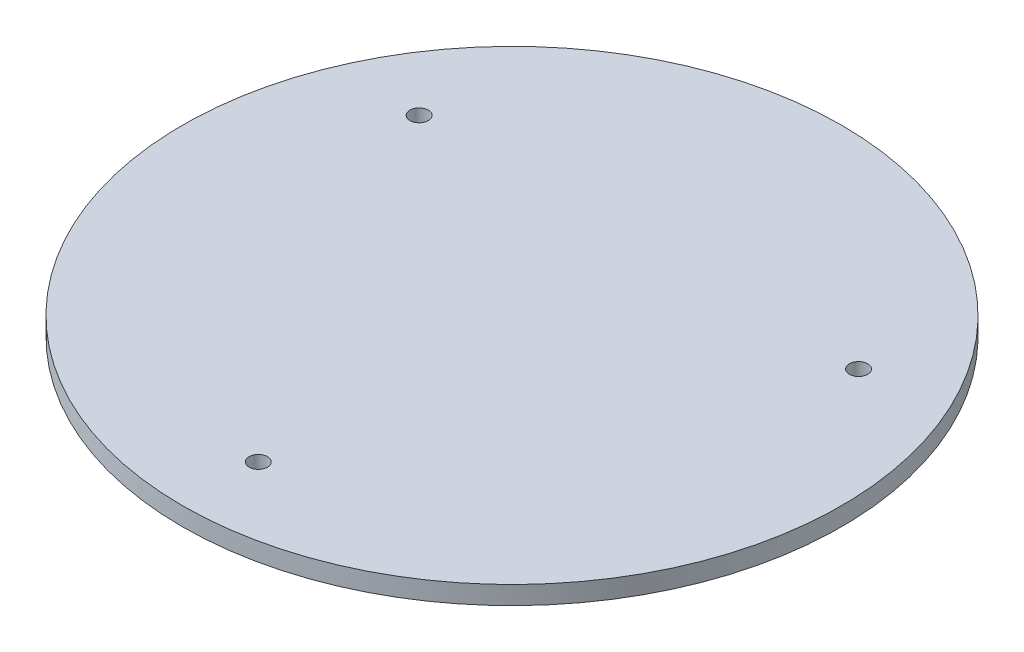
ISO-10303-21;
HEADER;
FILE_DESCRIPTION(('STEP AP214'),'2;1');
FILE_NAME('part.step','',(''),(''),'','','');
FILE_SCHEMA(('AUTOMOTIVE_DESIGN { 1 0 10303 214 1 1 1 1 }'));
ENDSEC;
DATA;
#1=APPLICATION_CONTEXT('core data for automotive mechanical design processes');
#2=APPLICATION_PROTOCOL_DEFINITION('international standard','automotive_design',2000,#1);
#3=PRODUCT_CONTEXT('',#1,'mechanical');
#4=PRODUCT('Part','Part','',(#3));
#5=PRODUCT_RELATED_PRODUCT_CATEGORY('part','',(#4));
#6=PRODUCT_DEFINITION_FORMATION('','',#4);
#7=PRODUCT_DEFINITION_CONTEXT('part definition',#1,'design');
#8=PRODUCT_DEFINITION('design','',#6,#7);
#9=PRODUCT_DEFINITION_SHAPE('','',#8);
#10=(LENGTH_UNIT() NAMED_UNIT(*) SI_UNIT(.MILLI.,.METRE.));
#11=(NAMED_UNIT(*) PLANE_ANGLE_UNIT() SI_UNIT($,.RADIAN.));
#12=(NAMED_UNIT(*) SI_UNIT($,.STERADIAN.) SOLID_ANGLE_UNIT());
#13=UNCERTAINTY_MEASURE_WITH_UNIT(LENGTH_MEASURE(1.E-05),#10,'distance_accuracy_value','');
#14=(GEOMETRIC_REPRESENTATION_CONTEXT(3) GLOBAL_UNCERTAINTY_ASSIGNED_CONTEXT((#13)) GLOBAL_UNIT_ASSIGNED_CONTEXT((#10,
#11,#12)) REPRESENTATION_CONTEXT('',''));
#15=CARTESIAN_POINT('',(0.,0.,0.));
#16=DIRECTION('',(0.,0.,1.));
#17=DIRECTION('',(1.,0.,0.));
#18=AXIS2_PLACEMENT_3D('',#15,#16,#17);
#19=CARTESIAN_POINT('',(0.,3.175,0.));
#20=DIRECTION('',(0.,-1.,0.));
#21=DIRECTION('',(0.,0.,-1.));
#22=AXIS2_PLACEMENT_3D('',#19,#20,#21);
#23=CYLINDRICAL_SURFACE('',#22,57.15);
#24=CARTESIAN_POINT('',(0.,3.175,0.));
#25=DIRECTION('',(0.,1.,0.));
#26=DIRECTION('',(0.,0.,1.));
#27=AXIS2_PLACEMENT_3D('',#24,#25,#26);
#28=CIRCLE('',#27,57.15);
#29=CARTESIAN_POINT('',(0.,3.175,57.15));
#30=VERTEX_POINT('',#29);
#31=EDGE_CURVE('E10',#30,#30,#28,.T.);
#32=ORIENTED_EDGE('',*,*,#31,.F.);
#33=EDGE_LOOP('',(#32));
#34=FACE_BOUND('',#33,.T.);
#35=CARTESIAN_POINT('',(0.,0.,0.));
#36=DIRECTION('',(0.,1.,0.));
#37=DIRECTION('',(0.,0.,1.));
#38=AXIS2_PLACEMENT_3D('',#35,#36,#37);
#39=CIRCLE('',#38,57.15);
#40=CARTESIAN_POINT('',(0.,0.,57.15));
#41=VERTEX_POINT('',#40);
#42=EDGE_CURVE('E38',#41,#41,#39,.T.);
#43=ORIENTED_EDGE('',*,*,#42,.T.);
#44=EDGE_LOOP('',(#43));
#45=FACE_BOUND('',#44,.T.);
#46=ADVANCED_FACE('F35',(#34,#45),#23,.T.);
#47=CARTESIAN_POINT('',(0.,3.175,0.));
#48=DIRECTION('',(0.,1.,0.));
#49=DIRECTION('',(0.,0.,1.));
#50=AXIS2_PLACEMENT_3D('',#47,#48,#49);
#51=PLANE('',#50);
#52=CARTESIAN_POINT('',(0.,3.175,43.9940905122495));
#53=DIRECTION('',(0.,1.,0.));
#54=DIRECTION('',(0.,0.,1.));
#55=AXIS2_PLACEMENT_3D('',#52,#53,#54);
#56=CIRCLE('',#55,1.5875);
#57=CARTESIAN_POINT('',(0.,3.175,45.5815905122495));
#58=VERTEX_POINT('',#57);
#59=EDGE_CURVE('E59',#58,#58,#56,.T.);
#60=ORIENTED_EDGE('',*,*,#59,.F.);
#61=EDGE_LOOP('',(#60));
#62=FACE_BOUND('',#61,.T.);
#63=CARTESIAN_POINT('',(-38.1,3.175,-21.9970452561247));
#64=DIRECTION('',(0.,1.,0.));
#65=DIRECTION('',(0.,0.,1.));
#66=AXIS2_PLACEMENT_3D('',#63,#64,#65);
#67=CIRCLE('',#66,1.5875);
#68=CARTESIAN_POINT('',(-38.1,3.175,-20.4095452561247));
#69=VERTEX_POINT('',#68);
#70=EDGE_CURVE('E53',#69,#69,#67,.T.);
#71=ORIENTED_EDGE('',*,*,#70,.F.);
#72=EDGE_LOOP('',(#71));
#73=FACE_BOUND('',#72,.T.);
#74=CARTESIAN_POINT('',(38.1,3.175,-21.9970452561247));
#75=DIRECTION('',(0.,1.,0.));
#76=DIRECTION('',(0.,0.,1.));
#77=AXIS2_PLACEMENT_3D('',#74,#75,#76);
#78=CIRCLE('',#77,1.5875);
#79=CARTESIAN_POINT('',(38.1,3.175,-20.4095452561247));
#80=VERTEX_POINT('',#79);
#81=EDGE_CURVE('E47',#80,#80,#78,.T.);
#82=ORIENTED_EDGE('',*,*,#81,.F.);
#83=EDGE_LOOP('',(#82));
#84=FACE_BOUND('',#83,.T.);
#85=ORIENTED_EDGE('',*,*,#31,.T.);
#86=EDGE_LOOP('',(#85));
#87=FACE_BOUND('',#86,.T.);
#88=ADVANCED_FACE('F75',(#62,#73,#84,#87),#51,.T.);
#89=CARTESIAN_POINT('',(0.,0.,0.));
#90=DIRECTION('',(0.,1.,0.));
#91=DIRECTION('',(0.,0.,1.));
#92=AXIS2_PLACEMENT_3D('',#89,#90,#91);
#93=PLANE('',#92);
#94=CARTESIAN_POINT('',(0.,0.,43.9940905122495));
#95=DIRECTION('',(0.,1.,0.));
#96=DIRECTION('',(0.,0.,1.));
#97=AXIS2_PLACEMENT_3D('',#94,#95,#96);
#98=CIRCLE('',#97,1.5875);
#99=CARTESIAN_POINT('',(0.,0.,45.5815905122495));
#100=VERTEX_POINT('',#99);
#101=EDGE_CURVE('E45',#100,#100,#98,.T.);
#102=ORIENTED_EDGE('',*,*,#101,.T.);
#103=EDGE_LOOP('',(#102));
#104=FACE_BOUND('',#103,.T.);
#105=CARTESIAN_POINT('',(-38.1,0.,-21.9970452561247));
#106=DIRECTION('',(0.,1.,0.));
#107=DIRECTION('',(0.,0.,1.));
#108=AXIS2_PLACEMENT_3D('',#105,#106,#107);
#109=CIRCLE('',#108,1.5875);
#110=CARTESIAN_POINT('',(-38.1,0.,-20.4095452561247));
#111=VERTEX_POINT('',#110);
#112=EDGE_CURVE('E56',#111,#111,#109,.T.);
#113=ORIENTED_EDGE('',*,*,#112,.T.);
#114=EDGE_LOOP('',(#113));
#115=FACE_BOUND('',#114,.T.);
#116=CARTESIAN_POINT('',(38.1,0.,-21.9970452561247));
#117=DIRECTION('',(0.,1.,0.));
#118=DIRECTION('',(0.,0.,1.));
#119=AXIS2_PLACEMENT_3D('',#116,#117,#118);
#120=CIRCLE('',#119,1.5875);
#121=CARTESIAN_POINT('',(38.1,0.,-20.4095452561247));
#122=VERTEX_POINT('',#121);
#123=EDGE_CURVE('E50',#122,#122,#120,.T.);
#124=ORIENTED_EDGE('',*,*,#123,.T.);
#125=EDGE_LOOP('',(#124));
#126=FACE_BOUND('',#125,.T.);
#127=ORIENTED_EDGE('',*,*,#42,.F.);
#128=EDGE_LOOP('',(#127));
#129=FACE_BOUND('',#128,.T.);
#130=ADVANCED_FACE('F65',(#104,#115,#126,#129),#93,.F.);
#131=CARTESIAN_POINT('',(38.1,0.,-21.9970452561247));
#132=DIRECTION('',(0.,1.,0.));
#133=DIRECTION('',(0.,0.,1.));
#134=AXIS2_PLACEMENT_3D('',#131,#132,#133);
#135=CYLINDRICAL_SURFACE('',#134,1.5875);
#136=ORIENTED_EDGE('',*,*,#123,.F.);
#137=EDGE_LOOP('',(#136));
#138=FACE_BOUND('',#137,.T.);
#139=ORIENTED_EDGE('',*,*,#81,.T.);
#140=EDGE_LOOP('',(#139));
#141=FACE_BOUND('',#140,.T.);
#142=ADVANCED_FACE('F83',(#138,#141),#135,.F.);
#143=CARTESIAN_POINT('',(-38.1,0.,-21.9970452561247));
#144=DIRECTION('',(0.,1.,0.));
#145=DIRECTION('',(0.,0.,1.));
#146=AXIS2_PLACEMENT_3D('',#143,#144,#145);
#147=CYLINDRICAL_SURFACE('',#146,1.5875);
#148=ORIENTED_EDGE('',*,*,#112,.F.);
#149=EDGE_LOOP('',(#148));
#150=FACE_BOUND('',#149,.T.);
#151=ORIENTED_EDGE('',*,*,#70,.T.);
#152=EDGE_LOOP('',(#151));
#153=FACE_BOUND('',#152,.T.);
#154=ADVANCED_FACE('F71',(#150,#153),#147,.F.);
#155=CARTESIAN_POINT('',(0.,0.,43.9940905122495));
#156=DIRECTION('',(0.,1.,0.));
#157=DIRECTION('',(0.,0.,1.));
#158=AXIS2_PLACEMENT_3D('',#155,#156,#157);
#159=CYLINDRICAL_SURFACE('',#158,1.5875);
#160=ORIENTED_EDGE('',*,*,#101,.F.);
#161=EDGE_LOOP('',(#160));
#162=FACE_BOUND('',#161,.T.);
#163=ORIENTED_EDGE('',*,*,#59,.T.);
#164=EDGE_LOOP('',(#163));
#165=FACE_BOUND('',#164,.T.);
#166=ADVANCED_FACE('F68',(#162,#165),#159,.F.);
#167=CLOSED_SHELL('',(#46,#88,#130,#142,#154,#166));
#168=MANIFOLD_SOLID_BREP('B2',#167);
#169=ADVANCED_BREP_SHAPE_REPRESENTATION('',(#18,#168),#14);
#170=SHAPE_DEFINITION_REPRESENTATION(#9,#169);
ENDSEC;
END-ISO-10303-21;
